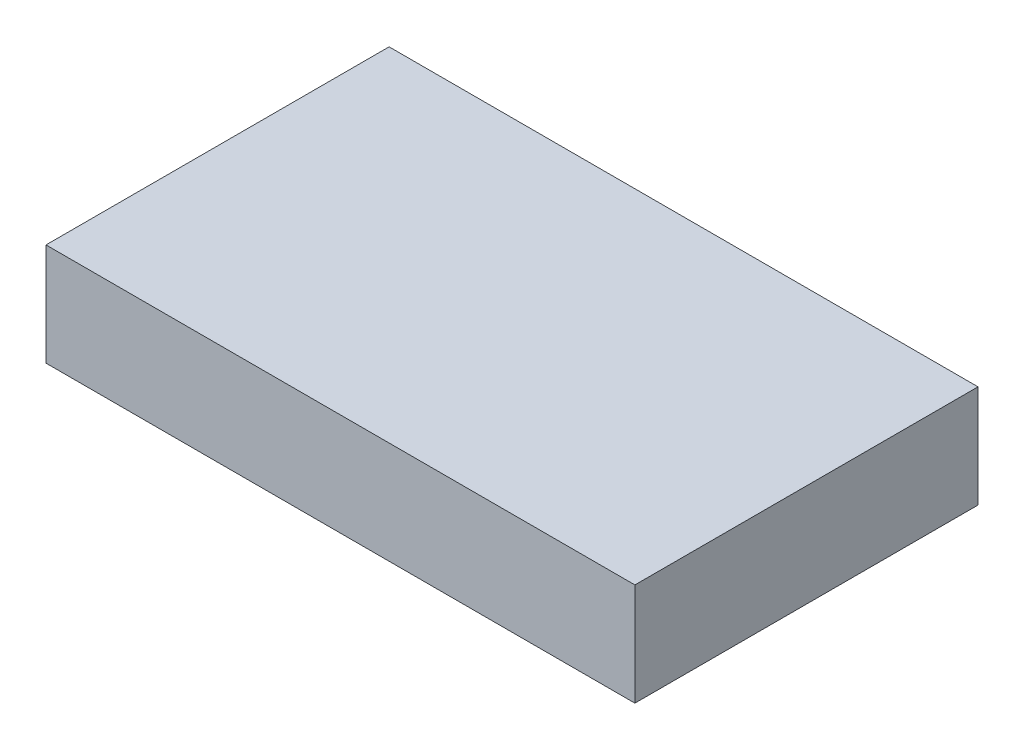
ISO-10303-21;
HEADER;
FILE_DESCRIPTION(('STEP AP214'),'2;1');
FILE_NAME('part.step','',(''),(''),'','','');
FILE_SCHEMA(('AUTOMOTIVE_DESIGN { 1 0 10303 214 1 1 1 1 }'));
ENDSEC;
DATA;
#1=APPLICATION_CONTEXT('core data for automotive mechanical design processes');
#2=APPLICATION_PROTOCOL_DEFINITION('international standard','automotive_design',2000,#1);
#3=PRODUCT_CONTEXT('',#1,'mechanical');
#4=PRODUCT('Part','Part','',(#3));
#5=PRODUCT_RELATED_PRODUCT_CATEGORY('part','',(#4));
#6=PRODUCT_DEFINITION_FORMATION('','',#4);
#7=PRODUCT_DEFINITION_CONTEXT('part definition',#1,'design');
#8=PRODUCT_DEFINITION('design','',#6,#7);
#9=PRODUCT_DEFINITION_SHAPE('','',#8);
#10=(LENGTH_UNIT() NAMED_UNIT(*) SI_UNIT(.MILLI.,.METRE.));
#11=(NAMED_UNIT(*) PLANE_ANGLE_UNIT() SI_UNIT($,.RADIAN.));
#12=(NAMED_UNIT(*) SI_UNIT($,.STERADIAN.) SOLID_ANGLE_UNIT());
#13=UNCERTAINTY_MEASURE_WITH_UNIT(LENGTH_MEASURE(1.E-05),#10,'distance_accuracy_value','');
#14=(GEOMETRIC_REPRESENTATION_CONTEXT(3) GLOBAL_UNCERTAINTY_ASSIGNED_CONTEXT((#13)) GLOBAL_UNIT_ASSIGNED_CONTEXT((#10,
#11,#12)) REPRESENTATION_CONTEXT('',''));
#15=CARTESIAN_POINT('',(0.,0.,0.));
#16=DIRECTION('',(0.,0.,1.));
#17=DIRECTION('',(1.,0.,0.));
#18=AXIS2_PLACEMENT_3D('',#15,#16,#17);
#19=CARTESIAN_POINT('',(57.5,20.,33.5));
#20=DIRECTION('',(-1.,0.,0.));
#21=DIRECTION('',(0.,0.,1.));
#22=AXIS2_PLACEMENT_3D('',#19,#20,#21);
#23=PLANE('',#22);
#24=DIRECTION('',(0.,0.,-1.));
#25=VECTOR('',#24,1.);
#26=CARTESIAN_POINT('',(57.5,0.,33.5));
#27=LINE('',#26,#25);
#28=CARTESIAN_POINT('',(57.5,0.,33.5));
#29=VERTEX_POINT('',#28);
#30=CARTESIAN_POINT('',(57.5,0.,-33.5));
#31=VERTEX_POINT('',#30);
#32=EDGE_CURVE('E98',#29,#31,#27,.T.);
#33=ORIENTED_EDGE('',*,*,#32,.T.);
#34=DIRECTION('',(0.,-1.,0.));
#35=VECTOR('',#34,1.);
#36=CARTESIAN_POINT('',(57.5,20.,-33.5));
#37=LINE('',#36,#35);
#38=CARTESIAN_POINT('',(57.5,20.,-33.5));
#39=VERTEX_POINT('',#38);
#40=EDGE_CURVE('E11',#39,#31,#37,.T.);
#41=ORIENTED_EDGE('',*,*,#40,.F.);
#42=DIRECTION('',(0.,0.,-1.));
#43=VECTOR('',#42,1.);
#44=CARTESIAN_POINT('',(57.5,20.,33.5));
#45=LINE('',#44,#43);
#46=CARTESIAN_POINT('',(57.5,20.,33.5));
#47=VERTEX_POINT('',#46);
#48=EDGE_CURVE('E86',#47,#39,#45,.T.);
#49=ORIENTED_EDGE('',*,*,#48,.F.);
#50=DIRECTION('',(0.,-1.,0.));
#51=VECTOR('',#50,1.);
#52=CARTESIAN_POINT('',(57.5,20.,33.5));
#53=LINE('',#52,#51);
#54=EDGE_CURVE('E94',#47,#29,#53,.T.);
#55=ORIENTED_EDGE('',*,*,#54,.T.);
#56=EDGE_LOOP('',(#33,#41,#49,#55));
#57=FACE_BOUND('',#56,.T.);
#58=ADVANCED_FACE('F35',(#57),#23,.F.);
#59=CARTESIAN_POINT('',(-57.5,20.,-33.5));
#60=DIRECTION('',(0.,0.,1.));
#61=DIRECTION('',(1.,0.,0.));
#62=AXIS2_PLACEMENT_3D('',#59,#60,#61);
#63=PLANE('',#62);
#64=DIRECTION('',(-1.,0.,0.));
#65=VECTOR('',#64,1.);
#66=CARTESIAN_POINT('',(-57.5,0.,-33.5));
#67=LINE('',#66,#65);
#68=CARTESIAN_POINT('',(-57.5,0.,-33.5));
#69=VERTEX_POINT('',#68);
#70=EDGE_CURVE('E90',#31,#69,#67,.T.);
#71=ORIENTED_EDGE('',*,*,#70,.T.);
#72=DIRECTION('',(0.,-1.,0.));
#73=VECTOR('',#72,1.);
#74=CARTESIAN_POINT('',(-57.5,20.,-33.5));
#75=LINE('',#74,#73);
#76=CARTESIAN_POINT('',(-57.5,20.,-33.5));
#77=VERTEX_POINT('',#76);
#78=EDGE_CURVE('E43',#77,#69,#75,.T.);
#79=ORIENTED_EDGE('',*,*,#78,.F.);
#80=DIRECTION('',(-1.,0.,0.));
#81=VECTOR('',#80,1.);
#82=CARTESIAN_POINT('',(-57.5,20.,-33.5));
#83=LINE('',#82,#81);
#84=EDGE_CURVE('E81',#39,#77,#83,.T.);
#85=ORIENTED_EDGE('',*,*,#84,.F.);
#86=ORIENTED_EDGE('',*,*,#40,.T.);
#87=EDGE_LOOP('',(#71,#79,#85,#86));
#88=FACE_BOUND('',#87,.T.);
#89=ADVANCED_FACE('F89',(#88),#63,.F.);
#90=CARTESIAN_POINT('',(-57.5,20.,33.5));
#91=DIRECTION('',(1.,0.,0.));
#92=DIRECTION('',(0.,0.,-1.));
#93=AXIS2_PLACEMENT_3D('',#90,#91,#92);
#94=PLANE('',#93);
#95=DIRECTION('',(0.,0.,1.));
#96=VECTOR('',#95,1.);
#97=CARTESIAN_POINT('',(-57.5,0.,33.5));
#98=LINE('',#97,#96);
#99=CARTESIAN_POINT('',(-57.5,0.,33.5));
#100=VERTEX_POINT('',#99);
#101=EDGE_CURVE('E68',#69,#100,#98,.T.);
#102=ORIENTED_EDGE('',*,*,#101,.T.);
#103=DIRECTION('',(0.,-1.,0.));
#104=VECTOR('',#103,1.);
#105=CARTESIAN_POINT('',(-57.5,20.,33.5));
#106=LINE('',#105,#104);
#107=CARTESIAN_POINT('',(-57.5,20.,33.5));
#108=VERTEX_POINT('',#107);
#109=EDGE_CURVE('E91',#108,#100,#106,.T.);
#110=ORIENTED_EDGE('',*,*,#109,.F.);
#111=DIRECTION('',(0.,0.,1.));
#112=VECTOR('',#111,1.);
#113=CARTESIAN_POINT('',(-57.5,20.,33.5));
#114=LINE('',#113,#112);
#115=EDGE_CURVE('E84',#77,#108,#114,.T.);
#116=ORIENTED_EDGE('',*,*,#115,.F.);
#117=ORIENTED_EDGE('',*,*,#78,.T.);
#118=EDGE_LOOP('',(#102,#110,#116,#117));
#119=FACE_BOUND('',#118,.T.);
#120=ADVANCED_FACE('F92',(#119),#94,.F.);
#121=CARTESIAN_POINT('',(-57.5,20.,33.5));
#122=DIRECTION('',(0.,0.,-1.));
#123=DIRECTION('',(-1.,0.,0.));
#124=AXIS2_PLACEMENT_3D('',#121,#122,#123);
#125=PLANE('',#124);
#126=DIRECTION('',(1.,0.,0.));
#127=VECTOR('',#126,1.);
#128=CARTESIAN_POINT('',(-57.5,0.,33.5));
#129=LINE('',#128,#127);
#130=EDGE_CURVE('E74',#100,#29,#129,.T.);
#131=ORIENTED_EDGE('',*,*,#130,.T.);
#132=ORIENTED_EDGE('',*,*,#54,.F.);
#133=DIRECTION('',(1.,0.,0.));
#134=VECTOR('',#133,1.);
#135=CARTESIAN_POINT('',(-57.5,20.,33.5));
#136=LINE('',#135,#134);
#137=EDGE_CURVE('E51',#108,#47,#136,.T.);
#138=ORIENTED_EDGE('',*,*,#137,.F.);
#139=ORIENTED_EDGE('',*,*,#109,.T.);
#140=EDGE_LOOP('',(#131,#132,#138,#139));
#141=FACE_BOUND('',#140,.T.);
#142=ADVANCED_FACE('F105',(#141),#125,.F.);
#143=CARTESIAN_POINT('',(0.,20.,0.));
#144=DIRECTION('',(0.,-1.,0.));
#145=DIRECTION('',(0.,0.,-1.));
#146=AXIS2_PLACEMENT_3D('',#143,#144,#145);
#147=PLANE('',#146);
#148=ORIENTED_EDGE('',*,*,#48,.T.);
#149=ORIENTED_EDGE('',*,*,#84,.T.);
#150=ORIENTED_EDGE('',*,*,#115,.T.);
#151=ORIENTED_EDGE('',*,*,#137,.T.);
#152=EDGE_LOOP('',(#148,#149,#150,#151));
#153=FACE_BOUND('',#152,.T.);
#154=ADVANCED_FACE('F82',(#153),#147,.F.);
#155=CARTESIAN_POINT('',(0.,0.,0.));
#156=DIRECTION('',(0.,-1.,0.));
#157=DIRECTION('',(0.,0.,-1.));
#158=AXIS2_PLACEMENT_3D('',#155,#156,#157);
#159=PLANE('',#158);
#160=ORIENTED_EDGE('',*,*,#32,.F.);
#161=ORIENTED_EDGE('',*,*,#130,.F.);
#162=ORIENTED_EDGE('',*,*,#101,.F.);
#163=ORIENTED_EDGE('',*,*,#70,.F.);
#164=EDGE_LOOP('',(#160,#161,#162,#163));
#165=FACE_BOUND('',#164,.T.);
#166=ADVANCED_FACE('F108',(#165),#159,.T.);
#167=CLOSED_SHELL('',(#58,#89,#120,#142,#154,#166));
#168=MANIFOLD_SOLID_BREP('B2',#167);
#169=ADVANCED_BREP_SHAPE_REPRESENTATION('',(#18,#168),#14);
#170=SHAPE_DEFINITION_REPRESENTATION(#9,#169);
ENDSEC;
END-ISO-10303-21;
